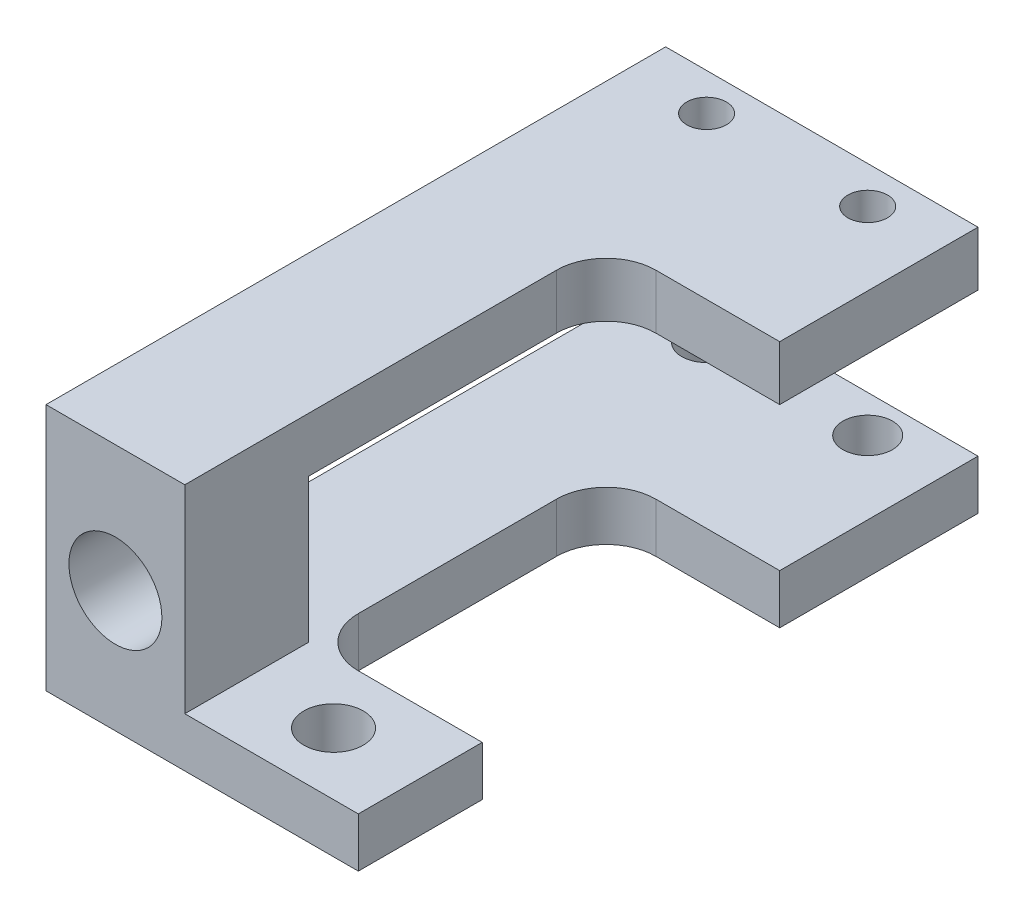
ISO-10303-21;
HEADER;
FILE_DESCRIPTION(('STEP AP214'),'2;1');
FILE_NAME('part.step','',(''),(''),'','','');
FILE_SCHEMA(('AUTOMOTIVE_DESIGN { 1 0 10303 214 1 1 1 1 }'));
ENDSEC;
DATA;
#1=APPLICATION_CONTEXT('core data for automotive mechanical design processes');
#2=APPLICATION_PROTOCOL_DEFINITION('international standard','automotive_design',2000,#1);
#3=PRODUCT_CONTEXT('',#1,'mechanical');
#4=PRODUCT('Part','Part','',(#3));
#5=PRODUCT_RELATED_PRODUCT_CATEGORY('part','',(#4));
#6=PRODUCT_DEFINITION_FORMATION('','',#4);
#7=PRODUCT_DEFINITION_CONTEXT('part definition',#1,'design');
#8=PRODUCT_DEFINITION('design','',#6,#7);
#9=PRODUCT_DEFINITION_SHAPE('','',#8);
#10=(LENGTH_UNIT() NAMED_UNIT(*) SI_UNIT(.MILLI.,.METRE.));
#11=(NAMED_UNIT(*) PLANE_ANGLE_UNIT() SI_UNIT($,.RADIAN.));
#12=(NAMED_UNIT(*) SI_UNIT($,.STERADIAN.) SOLID_ANGLE_UNIT());
#13=UNCERTAINTY_MEASURE_WITH_UNIT(LENGTH_MEASURE(1.E-05),#10,'distance_accuracy_value','');
#14=(GEOMETRIC_REPRESENTATION_CONTEXT(3) GLOBAL_UNCERTAINTY_ASSIGNED_CONTEXT((#13)) GLOBAL_UNIT_ASSIGNED_CONTEXT((#10,
#11,#12)) REPRESENTATION_CONTEXT('',''));
#15=CARTESIAN_POINT('',(0.,0.,0.));
#16=DIRECTION('',(0.,0.,1.));
#17=DIRECTION('',(1.,0.,0.));
#18=AXIS2_PLACEMENT_3D('',#15,#16,#17);
#19=CARTESIAN_POINT('',(6.3,10.,12.5));
#20=DIRECTION('',(-1.,0.,0.));
#21=DIRECTION('',(0.,0.,1.));
#22=AXIS2_PLACEMENT_3D('',#19,#20,#21);
#23=PLANE('',#22);
#24=DIRECTION('',(0.,0.,1.));
#25=VECTOR('',#24,1.);
#26=CARTESIAN_POINT('',(6.3,2.,-12.5));
#27=LINE('',#26,#25);
#28=CARTESIAN_POINT('',(6.3,2.,-12.5));
#29=VERTEX_POINT('',#28);
#30=CARTESIAN_POINT('',(6.3,2.,-4.5));
#31=VERTEX_POINT('',#30);
#32=EDGE_CURVE('E368',#29,#31,#27,.T.);
#33=ORIENTED_EDGE('',*,*,#32,.T.);
#34=DIRECTION('',(0.,1.,0.));
#35=VECTOR('',#34,1.);
#36=CARTESIAN_POINT('',(6.3,0.,-4.5));
#37=LINE('',#36,#35);
#38=CARTESIAN_POINT('',(6.3,0.,-4.5));
#39=VERTEX_POINT('',#38);
#40=EDGE_CURVE('E316',#39,#31,#37,.T.);
#41=ORIENTED_EDGE('',*,*,#40,.F.);
#42=DIRECTION('',(0.,0.,-1.));
#43=VECTOR('',#42,1.);
#44=CARTESIAN_POINT('',(6.3,0.,12.5));
#45=LINE('',#44,#43);
#46=CARTESIAN_POINT('',(6.3,0.,-12.5));
#47=VERTEX_POINT('',#46);
#48=EDGE_CURVE('E215',#39,#47,#45,.T.);
#49=ORIENTED_EDGE('',*,*,#48,.T.);
#50=DIRECTION('',(0.,-1.,0.));
#51=VECTOR('',#50,1.);
#52=CARTESIAN_POINT('',(6.3,10.,-12.5));
#53=LINE('',#52,#51);
#54=EDGE_CURVE('E234',#29,#47,#53,.T.);
#55=ORIENTED_EDGE('',*,*,#54,.F.);
#56=EDGE_LOOP('',(#33,#41,#49,#55));
#57=FACE_BOUND('',#56,.T.);
#58=ADVANCED_FACE('F40',(#57),#23,.F.);
#59=DIRECTION('',(0.,0.,-1.));
#60=VECTOR('',#59,1.);
#61=CARTESIAN_POINT('',(6.3,10.,12.5));
#62=LINE('',#61,#60);
#63=CARTESIAN_POINT('',(6.3,10.,-4.5));
#64=VERTEX_POINT('',#63);
#65=CARTESIAN_POINT('',(6.3,10.,-12.5));
#66=VERTEX_POINT('',#65);
#67=EDGE_CURVE('E225',#64,#66,#62,.T.);
#68=ORIENTED_EDGE('',*,*,#67,.F.);
#69=CARTESIAN_POINT('',(6.3,7.8,-4.5));
#70=VERTEX_POINT('',#69);
#71=EDGE_CURVE('E321',#70,#64,#37,.T.);
#72=ORIENTED_EDGE('',*,*,#71,.F.);
#73=DIRECTION('',(0.,0.,1.));
#74=VECTOR('',#73,1.);
#75=CARTESIAN_POINT('',(6.3,7.8,-12.5));
#76=LINE('',#75,#74);
#77=CARTESIAN_POINT('',(6.3,7.8,-12.5));
#78=VERTEX_POINT('',#77);
#79=EDGE_CURVE('E364',#78,#70,#76,.T.);
#80=ORIENTED_EDGE('',*,*,#79,.F.);
#81=EDGE_CURVE('E235',#66,#78,#53,.T.);
#82=ORIENTED_EDGE('',*,*,#81,.F.);
#83=EDGE_LOOP('',(#68,#72,#80,#82));
#84=FACE_BOUND('',#83,.T.);
#85=ADVANCED_FACE('F456',(#84),#23,.F.);
#86=CARTESIAN_POINT('',(6.3,7.8,-12.5));
#87=DIRECTION('',(0.,1.,0.));
#88=DIRECTION('',(-1.,0.,0.));
#89=AXIS2_PLACEMENT_3D('',#86,#87,#88);
#90=PLANE('',#89);
#91=CARTESIAN_POINT('',(3.35,7.8,-11.));
#92=DIRECTION('',(0.,1.,0.));
#93=DIRECTION('',(-1.,0.,0.));
#94=AXIS2_PLACEMENT_3D('',#91,#92,#93);
#95=CIRCLE('',#94,0.799999999999998);
#96=CARTESIAN_POINT('',(2.55,7.8,-11.));
#97=VERTEX_POINT('',#96);
#98=EDGE_CURVE('E541',#97,#97,#95,.T.);
#99=ORIENTED_EDGE('',*,*,#98,.T.);
#100=EDGE_LOOP('',(#99));
#101=FACE_BOUND('',#100,.T.);
#102=CARTESIAN_POINT('',(-3.15,7.8,-11.));
#103=DIRECTION('',(0.,1.,0.));
#104=DIRECTION('',(-1.,0.,0.));
#105=AXIS2_PLACEMENT_3D('',#102,#103,#104);
#106=CIRCLE('',#105,0.799999999999998);
#107=CARTESIAN_POINT('',(-3.95,7.8,-11.));
#108=VERTEX_POINT('',#107);
#109=EDGE_CURVE('E290',#108,#108,#106,.T.);
#110=ORIENTED_EDGE('',*,*,#109,.T.);
#111=EDGE_LOOP('',(#110));
#112=FACE_BOUND('',#111,.T.);
#113=ORIENTED_EDGE('',*,*,#79,.T.);
#114=DIRECTION('',(-1.,0.,0.));
#115=VECTOR('',#114,1.);
#116=CARTESIAN_POINT('',(6.3,7.8,-4.5));
#117=LINE('',#116,#115);
#118=CARTESIAN_POINT('',(1.3,7.8,-4.5));
#119=VERTEX_POINT('',#118);
#120=EDGE_CURVE('E239',#70,#119,#117,.T.);
#121=ORIENTED_EDGE('',*,*,#120,.T.);
#122=CARTESIAN_POINT('',(1.3,7.8,-2.5));
#123=DIRECTION('',(0.,1.,0.));
#124=DIRECTION('',(-1.,0.,0.));
#125=AXIS2_PLACEMENT_3D('',#122,#123,#124);
#126=CIRCLE('',#125,2.);
#127=CARTESIAN_POINT('',(-0.7,7.8,-2.5));
#128=VERTEX_POINT('',#127);
#129=EDGE_CURVE('E263',#119,#128,#126,.T.);
#130=ORIENTED_EDGE('',*,*,#129,.T.);
#131=DIRECTION('',(0.,0.,1.));
#132=VECTOR('',#131,1.);
#133=CARTESIAN_POINT('',(-0.7,7.8,-12.5));
#134=LINE('',#133,#132);
#135=CARTESIAN_POINT('',(-0.7,7.8,7.5));
#136=VERTEX_POINT('',#135);
#137=EDGE_CURVE('E320',#128,#136,#134,.T.);
#138=ORIENTED_EDGE('',*,*,#137,.T.);
#139=DIRECTION('',(1.,0.,0.));
#140=VECTOR('',#139,1.);
#141=CARTESIAN_POINT('',(-6.3,7.79999999999999,7.5));
#142=LINE('',#141,#140);
#143=CARTESIAN_POINT('',(-6.3,7.79999999999999,7.5));
#144=VERTEX_POINT('',#143);
#145=EDGE_CURVE('E349',#144,#136,#142,.T.);
#146=ORIENTED_EDGE('',*,*,#145,.F.);
#147=DIRECTION('',(0.,0.,1.));
#148=VECTOR('',#147,1.);
#149=CARTESIAN_POINT('',(-6.3,7.8,-12.5));
#150=LINE('',#149,#148);
#151=CARTESIAN_POINT('',(-6.3,7.8,-12.5));
#152=VERTEX_POINT('',#151);
#153=EDGE_CURVE('E337',#152,#144,#150,.T.);
#154=ORIENTED_EDGE('',*,*,#153,.F.);
#155=DIRECTION('',(-1.,0.,0.));
#156=VECTOR('',#155,1.);
#157=CARTESIAN_POINT('',(6.3,7.8,-12.5));
#158=LINE('',#157,#156);
#159=EDGE_CURVE('E358',#78,#152,#158,.T.);
#160=ORIENTED_EDGE('',*,*,#159,.F.);
#161=EDGE_LOOP('',(#113,#121,#130,#138,#146,#154,#160));
#162=FACE_BOUND('',#161,.T.);
#163=ADVANCED_FACE('F411',(#101,#112,#162),#90,.F.);
#164=CARTESIAN_POINT('',(-6.3,10.,-12.5));
#165=DIRECTION('',(0.,0.,1.));
#166=DIRECTION('',(1.,0.,0.));
#167=AXIS2_PLACEMENT_3D('',#164,#165,#166);
#168=PLANE('',#167);
#169=DIRECTION('',(0.,-1.,0.));
#170=VECTOR('',#169,1.);
#171=CARTESIAN_POINT('',(-6.3,10.,-12.5));
#172=LINE('',#171,#170);
#173=CARTESIAN_POINT('',(-6.3,2.,-12.5));
#174=VERTEX_POINT('',#173);
#175=CARTESIAN_POINT('',(-6.3,0.,-12.5));
#176=VERTEX_POINT('',#175);
#177=EDGE_CURVE('E229',#174,#176,#172,.T.);
#178=ORIENTED_EDGE('',*,*,#177,.F.);
#179=DIRECTION('',(1.,0.,0.));
#180=VECTOR('',#179,1.);
#181=CARTESIAN_POINT('',(6.3,2.,-12.5));
#182=LINE('',#181,#180);
#183=EDGE_CURVE('E361',#174,#29,#182,.T.);
#184=ORIENTED_EDGE('',*,*,#183,.T.);
#185=ORIENTED_EDGE('',*,*,#54,.T.);
#186=DIRECTION('',(-1.,0.,0.));
#187=VECTOR('',#186,1.);
#188=CARTESIAN_POINT('',(-6.3,0.,-12.5));
#189=LINE('',#188,#187);
#190=EDGE_CURVE('E214',#47,#176,#189,.T.);
#191=ORIENTED_EDGE('',*,*,#190,.T.);
#192=EDGE_LOOP('',(#178,#184,#185,#191));
#193=FACE_BOUND('',#192,.T.);
#194=ADVANCED_FACE('F430',(#193),#168,.F.);
#195=CARTESIAN_POINT('',(6.3,0.,12.5));
#196=VERTEX_POINT('',#195);
#197=CARTESIAN_POINT('',(6.3,0.,7.5));
#198=VERTEX_POINT('',#197);
#199=EDGE_CURVE('E210',#196,#198,#45,.T.);
#200=ORIENTED_EDGE('',*,*,#199,.T.);
#201=DIRECTION('',(0.,1.,0.));
#202=VECTOR('',#201,1.);
#203=CARTESIAN_POINT('',(6.3,0.,7.5));
#204=LINE('',#203,#202);
#205=CARTESIAN_POINT('',(6.3,2.,7.5));
#206=VERTEX_POINT('',#205);
#207=EDGE_CURVE('E315',#198,#206,#204,.T.);
#208=ORIENTED_EDGE('',*,*,#207,.T.);
#209=CARTESIAN_POINT('',(6.3,2.,12.5));
#210=VERTEX_POINT('',#209);
#211=EDGE_CURVE('E372',#206,#210,#27,.T.);
#212=ORIENTED_EDGE('',*,*,#211,.T.);
#213=DIRECTION('',(0.,-1.,0.));
#214=VECTOR('',#213,1.);
#215=CARTESIAN_POINT('',(6.3,10.,12.5));
#216=LINE('',#215,#214);
#217=EDGE_CURVE('E200',#210,#196,#216,.T.);
#218=ORIENTED_EDGE('',*,*,#217,.T.);
#219=EDGE_LOOP('',(#200,#208,#212,#218));
#220=FACE_BOUND('',#219,.T.);
#221=ADVANCED_FACE('F400',(#220),#23,.F.);
#222=ORIENTED_EDGE('',*,*,#159,.T.);
#223=CARTESIAN_POINT('',(-6.3,10.,-12.5));
#224=VERTEX_POINT('',#223);
#225=EDGE_CURVE('E230',#224,#152,#172,.T.);
#226=ORIENTED_EDGE('',*,*,#225,.F.);
#227=DIRECTION('',(-1.,0.,0.));
#228=VECTOR('',#227,1.);
#229=CARTESIAN_POINT('',(-6.3,10.,-12.5));
#230=LINE('',#229,#228);
#231=EDGE_CURVE('E206',#66,#224,#230,.T.);
#232=ORIENTED_EDGE('',*,*,#231,.F.);
#233=ORIENTED_EDGE('',*,*,#81,.T.);
#234=EDGE_LOOP('',(#222,#226,#232,#233));
#235=FACE_BOUND('',#234,.T.);
#236=ADVANCED_FACE('F387',(#235),#168,.F.);
#237=CARTESIAN_POINT('',(-6.3,10.,12.5));
#238=DIRECTION('',(1.,0.,0.));
#239=DIRECTION('',(0.,0.,-1.));
#240=AXIS2_PLACEMENT_3D('',#237,#238,#239);
#241=PLANE('',#240);
#242=DIRECTION('',(0.,-1.,0.));
#243=VECTOR('',#242,1.);
#244=CARTESIAN_POINT('',(-6.3,7.79999999999999,7.5));
#245=LINE('',#244,#243);
#246=CARTESIAN_POINT('',(-6.3,2.,7.5));
#247=VERTEX_POINT('',#246);
#248=EDGE_CURVE('E341',#144,#247,#245,.T.);
#249=ORIENTED_EDGE('',*,*,#248,.T.);
#250=DIRECTION('',(0.,0.,-1.));
#251=VECTOR('',#250,1.);
#252=CARTESIAN_POINT('',(-6.3,2.,-12.5));
#253=LINE('',#252,#251);
#254=EDGE_CURVE('E345',#247,#174,#253,.T.);
#255=ORIENTED_EDGE('',*,*,#254,.T.);
#256=ORIENTED_EDGE('',*,*,#177,.T.);
#257=DIRECTION('',(0.,0.,1.));
#258=VECTOR('',#257,1.);
#259=CARTESIAN_POINT('',(-6.3,0.,12.5));
#260=LINE('',#259,#258);
#261=CARTESIAN_POINT('',(-6.3,0.,12.5));
#262=VERTEX_POINT('',#261);
#263=EDGE_CURVE('E219',#176,#262,#260,.T.);
#264=ORIENTED_EDGE('',*,*,#263,.T.);
#265=DIRECTION('',(0.,-1.,0.));
#266=VECTOR('',#265,1.);
#267=CARTESIAN_POINT('',(-6.3,10.,12.5));
#268=LINE('',#267,#266);
#269=CARTESIAN_POINT('',(-6.3,10.,12.5));
#270=VERTEX_POINT('',#269);
#271=EDGE_CURVE('E204',#270,#262,#268,.T.);
#272=ORIENTED_EDGE('',*,*,#271,.F.);
#273=DIRECTION('',(0.,0.,1.));
#274=VECTOR('',#273,1.);
#275=CARTESIAN_POINT('',(-6.3,10.,12.5));
#276=LINE('',#275,#274);
#277=EDGE_CURVE('E197',#224,#270,#276,.T.);
#278=ORIENTED_EDGE('',*,*,#277,.F.);
#279=ORIENTED_EDGE('',*,*,#225,.T.);
#280=ORIENTED_EDGE('',*,*,#153,.T.);
#281=EDGE_LOOP('',(#249,#255,#256,#264,#272,#278,#279,#280));
#282=FACE_BOUND('',#281,.T.);
#283=ADVANCED_FACE('F390',(#282),#241,.F.);
#284=CARTESIAN_POINT('',(-6.3,10.,12.5));
#285=DIRECTION('',(0.,0.,-1.));
#286=DIRECTION('',(-1.,0.,0.));
#287=AXIS2_PLACEMENT_3D('',#284,#285,#286);
#288=PLANE('',#287);
#289=CARTESIAN_POINT('',(-3.5,4.9,12.5));
#290=DIRECTION('',(0.,0.,-1.));
#291=DIRECTION('',(0.,1.,0.));
#292=AXIS2_PLACEMENT_3D('',#289,#290,#291);
#293=CIRCLE('',#292,1.875);
#294=CARTESIAN_POINT('',(-3.5,6.775,12.5));
#295=VERTEX_POINT('',#294);
#296=EDGE_CURVE('E182',#295,#295,#293,.T.);
#297=ORIENTED_EDGE('',*,*,#296,.T.);
#298=EDGE_LOOP('',(#297));
#299=FACE_BOUND('',#298,.T.);
#300=DIRECTION('',(0.,-1.,0.));
#301=VECTOR('',#300,1.);
#302=CARTESIAN_POINT('',(-0.7,7.8,12.5));
#303=LINE('',#302,#301);
#304=CARTESIAN_POINT('',(-0.7,10.,12.5));
#305=VERTEX_POINT('',#304);
#306=CARTESIAN_POINT('',(-0.699999999999999,2.,12.5));
#307=VERTEX_POINT('',#306);
#308=EDGE_CURVE('E174',#305,#307,#303,.T.);
#309=ORIENTED_EDGE('',*,*,#308,.F.);
#310=DIRECTION('',(1.,0.,0.));
#311=VECTOR('',#310,1.);
#312=CARTESIAN_POINT('',(-6.3,10.,12.5));
#313=LINE('',#312,#311);
#314=EDGE_CURVE('E188',#270,#305,#313,.T.);
#315=ORIENTED_EDGE('',*,*,#314,.F.);
#316=ORIENTED_EDGE('',*,*,#271,.T.);
#317=DIRECTION('',(1.,0.,0.));
#318=VECTOR('',#317,1.);
#319=CARTESIAN_POINT('',(-6.3,0.,12.5));
#320=LINE('',#319,#318);
#321=EDGE_CURVE('E222',#262,#196,#320,.T.);
#322=ORIENTED_EDGE('',*,*,#321,.T.);
#323=ORIENTED_EDGE('',*,*,#217,.F.);
#324=DIRECTION('',(1.,0.,0.));
#325=VECTOR('',#324,1.);
#326=CARTESIAN_POINT('',(6.3,2.,12.5));
#327=LINE('',#326,#325);
#328=EDGE_CURVE('E191',#307,#210,#327,.T.);
#329=ORIENTED_EDGE('',*,*,#328,.F.);
#330=EDGE_LOOP('',(#309,#315,#316,#322,#323,#329));
#331=FACE_BOUND('',#330,.T.);
#332=ADVANCED_FACE('F186',(#299,#331),#288,.F.);
#333=CARTESIAN_POINT('',(0.,10.,0.));
#334=DIRECTION('',(0.,-1.,0.));
#335=DIRECTION('',(0.,0.,-1.));
#336=AXIS2_PLACEMENT_3D('',#333,#334,#335);
#337=PLANE('',#336);
#338=CARTESIAN_POINT('',(3.35,10.,-11.));
#339=DIRECTION('',(0.,1.,0.));
#340=DIRECTION('',(0.,0.,1.));
#341=AXIS2_PLACEMENT_3D('',#338,#339,#340);
#342=CIRCLE('',#341,0.799999999999999);
#343=CARTESIAN_POINT('',(3.35,10.,-10.2));
#344=VERTEX_POINT('',#343);
#345=EDGE_CURVE('E535',#344,#344,#342,.T.);
#346=ORIENTED_EDGE('',*,*,#345,.F.);
#347=EDGE_LOOP('',(#346));
#348=FACE_BOUND('',#347,.T.);
#349=CARTESIAN_POINT('',(-3.15,10.,-11.));
#350=DIRECTION('',(0.,1.,0.));
#351=DIRECTION('',(0.,0.,1.));
#352=AXIS2_PLACEMENT_3D('',#349,#350,#351);
#353=CIRCLE('',#352,0.799999999999999);
#354=CARTESIAN_POINT('',(-3.15,10.,-10.2));
#355=VERTEX_POINT('',#354);
#356=EDGE_CURVE('E544',#355,#355,#353,.T.);
#357=ORIENTED_EDGE('',*,*,#356,.F.);
#358=EDGE_LOOP('',(#357));
#359=FACE_BOUND('',#358,.T.);
#360=ORIENTED_EDGE('',*,*,#314,.T.);
#361=DIRECTION('',(0.,0.,1.));
#362=VECTOR('',#361,1.);
#363=CARTESIAN_POINT('',(-0.7,10.,7.5));
#364=LINE('',#363,#362);
#365=CARTESIAN_POINT('',(-0.7,10.,-2.5));
#366=VERTEX_POINT('',#365);
#367=EDGE_CURVE('E169',#366,#305,#364,.T.);
#368=ORIENTED_EDGE('',*,*,#367,.F.);
#369=CARTESIAN_POINT('',(1.3,10.,-2.5));
#370=DIRECTION('',(0.,-1.,0.));
#371=DIRECTION('',(0.,0.,-1.));
#372=AXIS2_PLACEMENT_3D('',#369,#370,#371);
#373=CIRCLE('',#372,2.);
#374=CARTESIAN_POINT('',(1.3,10.,-4.5));
#375=VERTEX_POINT('',#374);
#376=EDGE_CURVE('E260',#366,#375,#373,.T.);
#377=ORIENTED_EDGE('',*,*,#376,.T.);
#378=DIRECTION('',(-1.,0.,0.));
#379=VECTOR('',#378,1.);
#380=CARTESIAN_POINT('',(-0.7,10.,-4.5));
#381=LINE('',#380,#379);
#382=EDGE_CURVE('E181',#64,#375,#381,.T.);
#383=ORIENTED_EDGE('',*,*,#382,.F.);
#384=ORIENTED_EDGE('',*,*,#67,.T.);
#385=ORIENTED_EDGE('',*,*,#231,.T.);
#386=ORIENTED_EDGE('',*,*,#277,.T.);
#387=EDGE_LOOP('',(#360,#368,#377,#383,#384,#385,#386));
#388=FACE_BOUND('',#387,.T.);
#389=ADVANCED_FACE('F195',(#348,#359,#388),#337,.F.);
#390=CARTESIAN_POINT('',(0.,0.,0.));
#391=DIRECTION('',(0.,-1.,0.));
#392=DIRECTION('',(0.,0.,-1.));
#393=AXIS2_PLACEMENT_3D('',#390,#391,#392);
#394=PLANE('',#393);
#395=CARTESIAN_POINT('',(2.8,0.,10.));
#396=DIRECTION('',(0.,1.,0.));
#397=DIRECTION('',(0.,0.,1.));
#398=AXIS2_PLACEMENT_3D('',#395,#396,#397);
#399=CIRCLE('',#398,1.2);
#400=CARTESIAN_POINT('',(2.8,0.,11.2));
#401=VERTEX_POINT('',#400);
#402=EDGE_CURVE('E528',#401,#401,#399,.T.);
#403=ORIENTED_EDGE('',*,*,#402,.T.);
#404=EDGE_LOOP('',(#403));
#405=FACE_BOUND('',#404,.T.);
#406=CARTESIAN_POINT('',(3.35,0.,-11.));
#407=DIRECTION('',(0.,-1.,0.));
#408=DIRECTION('',(0.,0.,-1.));
#409=AXIS2_PLACEMENT_3D('',#406,#407,#408);
#410=CIRCLE('',#409,0.999999999999999);
#411=CARTESIAN_POINT('',(3.35,0.,-12.));
#412=VERTEX_POINT('',#411);
#413=EDGE_CURVE('E276',#412,#412,#410,.T.);
#414=ORIENTED_EDGE('',*,*,#413,.F.);
#415=EDGE_LOOP('',(#414));
#416=FACE_BOUND('',#415,.T.);
#417=CARTESIAN_POINT('',(-3.15,0.,-11.));
#418=DIRECTION('',(0.,-1.,0.));
#419=DIRECTION('',(0.,0.,-1.));
#420=AXIS2_PLACEMENT_3D('',#417,#418,#419);
#421=CIRCLE('',#420,1.);
#422=CARTESIAN_POINT('',(-3.15,0.,-12.));
#423=VERTEX_POINT('',#422);
#424=EDGE_CURVE('E284',#423,#423,#421,.T.);
#425=ORIENTED_EDGE('',*,*,#424,.F.);
#426=EDGE_LOOP('',(#425));
#427=FACE_BOUND('',#426,.T.);
#428=DIRECTION('',(-1.,0.,0.));
#429=VECTOR('',#428,1.);
#430=CARTESIAN_POINT('',(-0.699999999999999,0.,-4.5));
#431=LINE('',#430,#429);
#432=CARTESIAN_POINT('',(1.3,0.,-4.5));
#433=VERTEX_POINT('',#432);
#434=EDGE_CURVE('E311',#39,#433,#431,.T.);
#435=ORIENTED_EDGE('',*,*,#434,.T.);
#436=CARTESIAN_POINT('',(1.3,0.,-2.5));
#437=DIRECTION('',(0.,-1.,0.));
#438=DIRECTION('',(0.,0.,-1.));
#439=AXIS2_PLACEMENT_3D('',#436,#437,#438);
#440=CIRCLE('',#439,2.);
#441=CARTESIAN_POINT('',(-0.699999999999999,0.,-2.5));
#442=VERTEX_POINT('',#441);
#443=EDGE_CURVE('E269',#433,#442,#440,.F.);
#444=ORIENTED_EDGE('',*,*,#443,.T.);
#445=DIRECTION('',(0.,0.,1.));
#446=VECTOR('',#445,1.);
#447=CARTESIAN_POINT('',(-0.699999999999999,0.,7.5));
#448=LINE('',#447,#446);
#449=CARTESIAN_POINT('',(-0.699999999999999,0.,5.5));
#450=VERTEX_POINT('',#449);
#451=EDGE_CURVE('E304',#442,#450,#448,.T.);
#452=ORIENTED_EDGE('',*,*,#451,.T.);
#453=CARTESIAN_POINT('',(1.3,0.,5.5));
#454=DIRECTION('',(0.,-1.,0.));
#455=DIRECTION('',(0.,0.,-1.));
#456=AXIS2_PLACEMENT_3D('',#453,#454,#455);
#457=CIRCLE('',#456,2.);
#458=CARTESIAN_POINT('',(1.3,0.,7.5));
#459=VERTEX_POINT('',#458);
#460=EDGE_CURVE('E11',#450,#459,#457,.F.);
#461=ORIENTED_EDGE('',*,*,#460,.T.);
#462=DIRECTION('',(1.,0.,0.));
#463=VECTOR('',#462,1.);
#464=CARTESIAN_POINT('',(-0.699999999999999,0.,7.5));
#465=LINE('',#464,#463);
#466=EDGE_CURVE('E308',#459,#198,#465,.T.);
#467=ORIENTED_EDGE('',*,*,#466,.T.);
#468=ORIENTED_EDGE('',*,*,#199,.F.);
#469=ORIENTED_EDGE('',*,*,#321,.F.);
#470=ORIENTED_EDGE('',*,*,#263,.F.);
#471=ORIENTED_EDGE('',*,*,#190,.F.);
#472=ORIENTED_EDGE('',*,*,#48,.F.);
#473=EDGE_LOOP('',(#435,#444,#452,#461,#467,#468,#469,#470,#471,#472));
#474=FACE_BOUND('',#473,.T.);
#475=ADVANCED_FACE('F395',(#405,#416,#427,#474),#394,.T.);
#476=CARTESIAN_POINT('',(6.3,2.,-12.5));
#477=DIRECTION('',(0.,-1.,0.));
#478=DIRECTION('',(1.,0.,0.));
#479=AXIS2_PLACEMENT_3D('',#476,#477,#478);
#480=PLANE('',#479);
#481=CARTESIAN_POINT('',(2.8,2.,10.));
#482=DIRECTION('',(0.,1.,0.));
#483=DIRECTION('',(0.,0.,1.));
#484=AXIS2_PLACEMENT_3D('',#481,#482,#483);
#485=CIRCLE('',#484,1.2);
#486=CARTESIAN_POINT('',(2.8,2.,11.2));
#487=VERTEX_POINT('',#486);
#488=EDGE_CURVE('E531',#487,#487,#485,.T.);
#489=ORIENTED_EDGE('',*,*,#488,.F.);
#490=EDGE_LOOP('',(#489));
#491=FACE_BOUND('',#490,.T.);
#492=CARTESIAN_POINT('',(3.35,2.,-11.));
#493=DIRECTION('',(0.,-1.,0.));
#494=DIRECTION('',(1.,0.,0.));
#495=AXIS2_PLACEMENT_3D('',#492,#493,#494);
#496=CIRCLE('',#495,0.999999999999999);
#497=CARTESIAN_POINT('',(4.35,2.,-11.));
#498=VERTEX_POINT('',#497);
#499=EDGE_CURVE('E44',#498,#498,#496,.T.);
#500=ORIENTED_EDGE('',*,*,#499,.T.);
#501=EDGE_LOOP('',(#500));
#502=FACE_BOUND('',#501,.T.);
#503=CARTESIAN_POINT('',(-3.15,2.,-11.));
#504=DIRECTION('',(0.,-1.,0.));
#505=DIRECTION('',(1.,0.,0.));
#506=AXIS2_PLACEMENT_3D('',#503,#504,#505);
#507=CIRCLE('',#506,1.);
#508=CARTESIAN_POINT('',(-2.15,2.,-11.));
#509=VERTEX_POINT('',#508);
#510=EDGE_CURVE('E273',#509,#509,#507,.T.);
#511=ORIENTED_EDGE('',*,*,#510,.T.);
#512=EDGE_LOOP('',(#511));
#513=FACE_BOUND('',#512,.T.);
#514=ORIENTED_EDGE('',*,*,#211,.F.);
#515=DIRECTION('',(-1.,0.,0.));
#516=VECTOR('',#515,1.);
#517=CARTESIAN_POINT('',(6.3,2.,7.5));
#518=LINE('',#517,#516);
#519=CARTESIAN_POINT('',(1.3,2.,7.5));
#520=VERTEX_POINT('',#519);
#521=EDGE_CURVE('E329',#206,#520,#518,.T.);
#522=ORIENTED_EDGE('',*,*,#521,.T.);
#523=CARTESIAN_POINT('',(1.3,2.,5.5));
#524=DIRECTION('',(0.,-1.,0.));
#525=DIRECTION('',(1.,0.,0.));
#526=AXIS2_PLACEMENT_3D('',#523,#524,#525);
#527=CIRCLE('',#526,2.);
#528=CARTESIAN_POINT('',(-0.699999999999999,2.,5.5));
#529=VERTEX_POINT('',#528);
#530=EDGE_CURVE('E50',#520,#529,#527,.T.);
#531=ORIENTED_EDGE('',*,*,#530,.T.);
#532=DIRECTION('',(0.,0.,-1.));
#533=VECTOR('',#532,1.);
#534=CARTESIAN_POINT('',(-0.699999999999999,2.,-12.5));
#535=LINE('',#534,#533);
#536=CARTESIAN_POINT('',(-0.699999999999999,2.,-2.5));
#537=VERTEX_POINT('',#536);
#538=EDGE_CURVE('E58',#529,#537,#535,.T.);
#539=ORIENTED_EDGE('',*,*,#538,.T.);
#540=CARTESIAN_POINT('',(1.3,2.,-2.5));
#541=DIRECTION('',(0.,-1.,0.));
#542=DIRECTION('',(1.,0.,0.));
#543=AXIS2_PLACEMENT_3D('',#540,#541,#542);
#544=CIRCLE('',#543,2.);
#545=CARTESIAN_POINT('',(1.3,2.,-4.5));
#546=VERTEX_POINT('',#545);
#547=EDGE_CURVE('E266',#537,#546,#544,.T.);
#548=ORIENTED_EDGE('',*,*,#547,.T.);
#549=DIRECTION('',(1.,0.,0.));
#550=VECTOR('',#549,1.);
#551=CARTESIAN_POINT('',(6.3,2.,-4.5));
#552=LINE('',#551,#550);
#553=EDGE_CURVE('E333',#546,#31,#552,.T.);
#554=ORIENTED_EDGE('',*,*,#553,.T.);
#555=ORIENTED_EDGE('',*,*,#32,.F.);
#556=ORIENTED_EDGE('',*,*,#183,.F.);
#557=ORIENTED_EDGE('',*,*,#254,.F.);
#558=DIRECTION('',(1.,0.,0.));
#559=VECTOR('',#558,1.);
#560=CARTESIAN_POINT('',(-6.3,2.,7.5));
#561=LINE('',#560,#559);
#562=CARTESIAN_POINT('',(-0.699999999999999,2.,7.5));
#563=VERTEX_POINT('',#562);
#564=EDGE_CURVE('E193',#247,#563,#561,.T.);
#565=ORIENTED_EDGE('',*,*,#564,.T.);
#566=DIRECTION('',(0.,0.,1.));
#567=VECTOR('',#566,1.);
#568=CARTESIAN_POINT('',(-0.699999999999999,2.,-12.5));
#569=LINE('',#568,#567);
#570=EDGE_CURVE('E373',#563,#307,#569,.T.);
#571=ORIENTED_EDGE('',*,*,#570,.T.);
#572=ORIENTED_EDGE('',*,*,#328,.T.);
#573=EDGE_LOOP('',(#514,#522,#531,#539,#548,#554,#555,#556,#557,#565,#571,#572));
#574=FACE_BOUND('',#573,.T.);
#575=ADVANCED_FACE('F404',(#491,#502,#513,#574),#480,.F.);
#576=CARTESIAN_POINT('',(-0.7,7.8,-12.5));
#577=DIRECTION('',(-1.,0.,0.));
#578=DIRECTION('',(0.,-1.,0.));
#579=AXIS2_PLACEMENT_3D('',#576,#577,#578);
#580=PLANE('',#579);
#581=ORIENTED_EDGE('',*,*,#137,.F.);
#582=DIRECTION('',(0.,1.,0.));
#583=VECTOR('',#582,1.);
#584=CARTESIAN_POINT('',(-0.700000000000001,10.,-2.5));
#585=LINE('',#584,#583);
#586=EDGE_CURVE('E177',#128,#366,#585,.T.);
#587=ORIENTED_EDGE('',*,*,#586,.T.);
#588=ORIENTED_EDGE('',*,*,#367,.T.);
#589=ORIENTED_EDGE('',*,*,#308,.T.);
#590=ORIENTED_EDGE('',*,*,#570,.F.);
#591=DIRECTION('',(0.,-1.,0.));
#592=VECTOR('',#591,1.);
#593=CARTESIAN_POINT('',(-0.7,7.8,7.5));
#594=LINE('',#593,#592);
#595=EDGE_CURVE('E336',#136,#563,#594,.T.);
#596=ORIENTED_EDGE('',*,*,#595,.F.);
#597=EDGE_LOOP('',(#581,#587,#588,#589,#590,#596));
#598=FACE_BOUND('',#597,.T.);
#599=ADVANCED_FACE('F172',(#598),#580,.F.);
#600=CARTESIAN_POINT('',(-6.3,7.79999999999999,7.5));
#601=DIRECTION('',(0.,0.,1.));
#602=DIRECTION('',(0.,-1.,0.));
#603=AXIS2_PLACEMENT_3D('',#600,#601,#602);
#604=PLANE('',#603);
#605=CARTESIAN_POINT('',(-3.5,4.9,7.5));
#606=DIRECTION('',(0.,0.,-1.));
#607=DIRECTION('',(0.,1.,0.));
#608=AXIS2_PLACEMENT_3D('',#605,#606,#607);
#609=CIRCLE('',#608,1.875);
#610=CARTESIAN_POINT('',(-3.5,6.775,7.5));
#611=VERTEX_POINT('',#610);
#612=EDGE_CURVE('E282',#611,#611,#609,.T.);
#613=ORIENTED_EDGE('',*,*,#612,.F.);
#614=EDGE_LOOP('',(#613));
#615=FACE_BOUND('',#614,.T.);
#616=ORIENTED_EDGE('',*,*,#595,.T.);
#617=ORIENTED_EDGE('',*,*,#564,.F.);
#618=ORIENTED_EDGE('',*,*,#248,.F.);
#619=ORIENTED_EDGE('',*,*,#145,.T.);
#620=EDGE_LOOP('',(#616,#617,#618,#619));
#621=FACE_BOUND('',#620,.T.);
#622=ADVANCED_FACE('F408',(#615,#621),#604,.F.);
#623=CARTESIAN_POINT('',(-0.699999999999999,0.,-4.5));
#624=DIRECTION('',(0.,0.,-1.));
#625=DIRECTION('',(-1.,0.,0.));
#626=AXIS2_PLACEMENT_3D('',#623,#624,#625);
#627=PLANE('',#626);
#628=ORIENTED_EDGE('',*,*,#382,.T.);
#629=DIRECTION('',(0.,1.,0.));
#630=VECTOR('',#629,1.);
#631=CARTESIAN_POINT('',(1.3,7.8,-4.5));
#632=LINE('',#631,#630);
#633=EDGE_CURVE('E245',#375,#119,#632,.F.);
#634=ORIENTED_EDGE('',*,*,#633,.T.);
#635=ORIENTED_EDGE('',*,*,#120,.F.);
#636=ORIENTED_EDGE('',*,*,#71,.T.);
#637=EDGE_LOOP('',(#628,#634,#635,#636));
#638=FACE_BOUND('',#637,.T.);
#639=ADVANCED_FACE('F417',(#638),#627,.F.);
#640=ORIENTED_EDGE('',*,*,#553,.F.);
#641=DIRECTION('',(0.,1.,0.));
#642=VECTOR('',#641,1.);
#643=CARTESIAN_POINT('',(1.3,0.,-4.5));
#644=LINE('',#643,#642);
#645=EDGE_CURVE('E254',#546,#433,#644,.F.);
#646=ORIENTED_EDGE('',*,*,#645,.T.);
#647=ORIENTED_EDGE('',*,*,#434,.F.);
#648=ORIENTED_EDGE('',*,*,#40,.T.);
#649=EDGE_LOOP('',(#640,#646,#647,#648));
#650=FACE_BOUND('',#649,.T.);
#651=ADVANCED_FACE('F436',(#650),#627,.F.);
#652=CARTESIAN_POINT('',(-0.699999999999999,0.,7.5));
#653=DIRECTION('',(0.,0.,1.));
#654=DIRECTION('',(1.,0.,0.));
#655=AXIS2_PLACEMENT_3D('',#652,#653,#654);
#656=PLANE('',#655);
#657=ORIENTED_EDGE('',*,*,#466,.F.);
#658=DIRECTION('',(0.,1.,0.));
#659=VECTOR('',#658,1.);
#660=CARTESIAN_POINT('',(1.3,2.,7.5));
#661=LINE('',#660,#659);
#662=EDGE_CURVE('E257',#459,#520,#661,.T.);
#663=ORIENTED_EDGE('',*,*,#662,.T.);
#664=ORIENTED_EDGE('',*,*,#521,.F.);
#665=ORIENTED_EDGE('',*,*,#207,.F.);
#666=EDGE_LOOP('',(#657,#663,#664,#665));
#667=FACE_BOUND('',#666,.T.);
#668=ADVANCED_FACE('F445',(#667),#656,.F.);
#669=CARTESIAN_POINT('',(-0.699999999999999,0.,7.5));
#670=DIRECTION('',(-1.,0.,0.));
#671=DIRECTION('',(0.,-1.,0.));
#672=AXIS2_PLACEMENT_3D('',#669,#670,#671);
#673=PLANE('',#672);
#674=ORIENTED_EDGE('',*,*,#451,.F.);
#675=DIRECTION('',(0.,1.,0.));
#676=VECTOR('',#675,1.);
#677=CARTESIAN_POINT('',(-0.7,2.,-2.5));
#678=LINE('',#677,#676);
#679=EDGE_CURVE('E251',#442,#537,#678,.T.);
#680=ORIENTED_EDGE('',*,*,#679,.T.);
#681=ORIENTED_EDGE('',*,*,#538,.F.);
#682=DIRECTION('',(0.,1.,0.));
#683=VECTOR('',#682,1.);
#684=CARTESIAN_POINT('',(-0.699999999999999,0.,5.5));
#685=LINE('',#684,#683);
#686=EDGE_CURVE('E248',#529,#450,#685,.F.);
#687=ORIENTED_EDGE('',*,*,#686,.T.);
#688=EDGE_LOOP('',(#674,#680,#681,#687));
#689=FACE_BOUND('',#688,.T.);
#690=ADVANCED_FACE('F442',(#689),#673,.F.);
#691=CARTESIAN_POINT('',(-3.5,4.9,12.5));
#692=DIRECTION('',(0.,0.,-1.));
#693=DIRECTION('',(0.,1.,0.));
#694=AXIS2_PLACEMENT_3D('',#691,#692,#693);
#695=CYLINDRICAL_SURFACE('',#694,1.875);
#696=ORIENTED_EDGE('',*,*,#296,.F.);
#697=EDGE_LOOP('',(#696));
#698=FACE_BOUND('',#697,.T.);
#699=ORIENTED_EDGE('',*,*,#612,.T.);
#700=EDGE_LOOP('',(#699));
#701=FACE_BOUND('',#700,.T.);
#702=ADVANCED_FACE('F452',(#698,#701),#695,.F.);
#703=CARTESIAN_POINT('',(1.3,7.8,-2.5));
#704=DIRECTION('',(0.,-1.,0.));
#705=DIRECTION('',(1.,0.,0.));
#706=AXIS2_PLACEMENT_3D('',#703,#704,#705);
#707=CYLINDRICAL_SURFACE('',#706,2.);
#708=ORIENTED_EDGE('',*,*,#129,.F.);
#709=ORIENTED_EDGE('',*,*,#633,.F.);
#710=ORIENTED_EDGE('',*,*,#376,.F.);
#711=ORIENTED_EDGE('',*,*,#586,.F.);
#712=EDGE_LOOP('',(#708,#709,#710,#711));
#713=FACE_BOUND('',#712,.T.);
#714=ADVANCED_FACE('F415',(#713),#707,.F.);
#715=CARTESIAN_POINT('',(1.3,0.,-2.5));
#716=DIRECTION('',(0.,-1.,0.));
#717=DIRECTION('',(1.,0.,0.));
#718=AXIS2_PLACEMENT_3D('',#715,#716,#717);
#719=CYLINDRICAL_SURFACE('',#718,2.);
#720=ORIENTED_EDGE('',*,*,#443,.F.);
#721=ORIENTED_EDGE('',*,*,#645,.F.);
#722=ORIENTED_EDGE('',*,*,#547,.F.);
#723=ORIENTED_EDGE('',*,*,#679,.F.);
#724=EDGE_LOOP('',(#720,#721,#722,#723));
#725=FACE_BOUND('',#724,.T.);
#726=ADVANCED_FACE('F441',(#725),#719,.F.);
#727=CARTESIAN_POINT('',(1.3,0.,5.5));
#728=DIRECTION('',(0.,-1.,0.));
#729=DIRECTION('',(1.,0.,0.));
#730=AXIS2_PLACEMENT_3D('',#727,#728,#729);
#731=CYLINDRICAL_SURFACE('',#730,2.);
#732=ORIENTED_EDGE('',*,*,#460,.F.);
#733=ORIENTED_EDGE('',*,*,#686,.F.);
#734=ORIENTED_EDGE('',*,*,#530,.F.);
#735=ORIENTED_EDGE('',*,*,#662,.F.);
#736=EDGE_LOOP('',(#732,#733,#734,#735));
#737=FACE_BOUND('',#736,.T.);
#738=ADVANCED_FACE('F42',(#737),#731,.F.);
#739=CARTESIAN_POINT('',(-3.15,5.,-11.));
#740=DIRECTION('',(0.,-1.,0.));
#741=DIRECTION('',(0.,0.,-1.));
#742=AXIS2_PLACEMENT_3D('',#739,#740,#741);
#743=CYLINDRICAL_SURFACE('',#742,1.);
#744=ORIENTED_EDGE('',*,*,#424,.T.);
#745=EDGE_LOOP('',(#744));
#746=FACE_BOUND('',#745,.T.);
#747=ORIENTED_EDGE('',*,*,#510,.F.);
#748=EDGE_LOOP('',(#747));
#749=FACE_BOUND('',#748,.T.);
#750=ADVANCED_FACE('F505',(#746,#749),#743,.F.);
#751=CARTESIAN_POINT('',(3.35,5.,-11.));
#752=DIRECTION('',(0.,-1.,0.));
#753=DIRECTION('',(0.,0.,-1.));
#754=AXIS2_PLACEMENT_3D('',#751,#752,#753);
#755=CYLINDRICAL_SURFACE('',#754,0.999999999999999);
#756=ORIENTED_EDGE('',*,*,#413,.T.);
#757=EDGE_LOOP('',(#756));
#758=FACE_BOUND('',#757,.T.);
#759=ORIENTED_EDGE('',*,*,#499,.F.);
#760=EDGE_LOOP('',(#759));
#761=FACE_BOUND('',#760,.T.);
#762=ADVANCED_FACE('F508',(#758,#761),#755,.F.);
#763=CARTESIAN_POINT('',(-3.15,10.,-11.));
#764=DIRECTION('',(0.,1.,0.));
#765=DIRECTION('',(0.,0.,1.));
#766=AXIS2_PLACEMENT_3D('',#763,#764,#765);
#767=CYLINDRICAL_SURFACE('',#766,0.799999999999998);
#768=ORIENTED_EDGE('',*,*,#356,.T.);
#769=EDGE_LOOP('',(#768));
#770=FACE_BOUND('',#769,.T.);
#771=ORIENTED_EDGE('',*,*,#109,.F.);
#772=EDGE_LOOP('',(#771));
#773=FACE_BOUND('',#772,.T.);
#774=ADVANCED_FACE('F512',(#770,#773),#767,.F.);
#775=CARTESIAN_POINT('',(3.35,10.,-11.));
#776=DIRECTION('',(0.,1.,0.));
#777=DIRECTION('',(0.,0.,1.));
#778=AXIS2_PLACEMENT_3D('',#775,#776,#777);
#779=CYLINDRICAL_SURFACE('',#778,0.799999999999998);
#780=ORIENTED_EDGE('',*,*,#345,.T.);
#781=EDGE_LOOP('',(#780));
#782=FACE_BOUND('',#781,.T.);
#783=ORIENTED_EDGE('',*,*,#98,.F.);
#784=EDGE_LOOP('',(#783));
#785=FACE_BOUND('',#784,.T.);
#786=ADVANCED_FACE('F515',(#782,#785),#779,.F.);
#787=CARTESIAN_POINT('',(2.8,2.,10.));
#788=DIRECTION('',(0.,1.,0.));
#789=DIRECTION('',(0.,0.,1.));
#790=AXIS2_PLACEMENT_3D('',#787,#788,#789);
#791=CYLINDRICAL_SURFACE('',#790,1.2);
#792=ORIENTED_EDGE('',*,*,#402,.F.);
#793=EDGE_LOOP('',(#792));
#794=FACE_BOUND('',#793,.T.);
#795=ORIENTED_EDGE('',*,*,#488,.T.);
#796=EDGE_LOOP('',(#795));
#797=FACE_BOUND('',#796,.T.);
#798=ADVANCED_FACE('F519',(#794,#797),#791,.F.);
#799=CLOSED_SHELL('',(#58,#85,#163,#194,#221,#236,#283,#332,#389,#475,#575,#599,#622,#639,#651,
#668,#690,#702,#714,#726,#738,#750,#762,#774,#786,#798));
#800=MANIFOLD_SOLID_BREP('B2',#799);
#801=ADVANCED_BREP_SHAPE_REPRESENTATION('',(#18,#800),#14);
#802=SHAPE_DEFINITION_REPRESENTATION(#9,#801);
ENDSEC;
END-ISO-10303-21;
